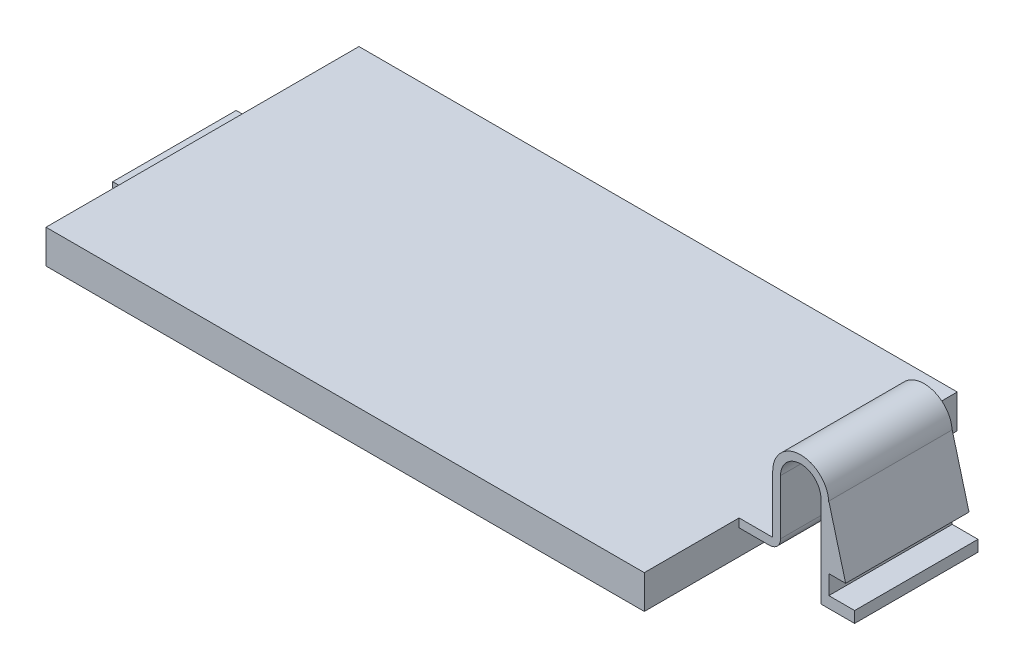
ISO-10303-21;
HEADER;
FILE_DESCRIPTION(('STEP AP214'),'2;1');
FILE_NAME('part.step','',(''),(''),'','','');
FILE_SCHEMA(('AUTOMOTIVE_DESIGN { 1 0 10303 214 1 1 1 1 }'));
ENDSEC;
DATA;
#1=APPLICATION_CONTEXT('core data for automotive mechanical design processes');
#2=APPLICATION_PROTOCOL_DEFINITION('international standard','automotive_design',2000,#1);
#3=PRODUCT_CONTEXT('',#1,'mechanical');
#4=PRODUCT('Part','Part','',(#3));
#5=PRODUCT_RELATED_PRODUCT_CATEGORY('part','',(#4));
#6=PRODUCT_DEFINITION_FORMATION('','',#4);
#7=PRODUCT_DEFINITION_CONTEXT('part definition',#1,'design');
#8=PRODUCT_DEFINITION('design','',#6,#7);
#9=PRODUCT_DEFINITION_SHAPE('','',#8);
#10=(LENGTH_UNIT() NAMED_UNIT(*) SI_UNIT(.MILLI.,.METRE.));
#11=(NAMED_UNIT(*) PLANE_ANGLE_UNIT() SI_UNIT($,.RADIAN.));
#12=(NAMED_UNIT(*) SI_UNIT($,.STERADIAN.) SOLID_ANGLE_UNIT());
#13=UNCERTAINTY_MEASURE_WITH_UNIT(LENGTH_MEASURE(1.E-05),#10,'distance_accuracy_value','');
#14=(GEOMETRIC_REPRESENTATION_CONTEXT(3) GLOBAL_UNCERTAINTY_ASSIGNED_CONTEXT((#13)) GLOBAL_UNIT_ASSIGNED_CONTEXT((#10,
#11,#12)) REPRESENTATION_CONTEXT('',''));
#15=CARTESIAN_POINT('',(0.,0.,0.));
#16=DIRECTION('',(0.,0.,1.));
#17=DIRECTION('',(1.,0.,0.));
#18=AXIS2_PLACEMENT_3D('',#15,#16,#17);
#19=CARTESIAN_POINT('',(57.9862488550397,2.66693819787849,5.39));
#20=DIRECTION('',(0.,0.,-1.));
#21=DIRECTION('',(-1.,0.,0.));
#22=AXIS2_PLACEMENT_3D('',#19,#20,#21);
#23=PLANE('',#22);
#24=DIRECTION('',(0.,1.,0.));
#25=VECTOR('',#24,1.);
#26=CARTESIAN_POINT('',(55.3402488550397,2.66693819787849,5.39));
#27=LINE('',#26,#25);
#28=CARTESIAN_POINT('',(55.3402488550397,1.6869381978785,5.39));
#29=VERTEX_POINT('',#28);
#30=CARTESIAN_POINT('',(55.3402488550397,2.4336981978785,5.39));
#31=VERTEX_POINT('',#30);
#32=EDGE_CURVE('E205',#29,#31,#27,.T.);
#33=ORIENTED_EDGE('',*,*,#32,.F.);
#34=DIRECTION('',(1.,0.,0.));
#35=VECTOR('',#34,1.);
#36=CARTESIAN_POINT('',(55.3402488550397,1.6869381978785,5.39));
#37=LINE('',#36,#35);
#38=CARTESIAN_POINT('',(57.9862488550397,1.68693819787849,5.39));
#39=VERTEX_POINT('',#38);
#40=EDGE_CURVE('E319',#29,#39,#37,.T.);
#41=ORIENTED_EDGE('',*,*,#40,.T.);
#42=CARTESIAN_POINT('',(57.9862488550397,2.66693819787849,5.39));
#43=DIRECTION('',(0.,0.,1.));
#44=DIRECTION('',(-1.,0.,0.));
#45=AXIS2_PLACEMENT_3D('',#42,#43,#44);
#46=CIRCLE('',#45,0.98);
#47=CARTESIAN_POINT('',(58.9662488550397,2.66693819787849,5.39));
#48=VERTEX_POINT('',#47);
#49=EDGE_CURVE('E321',#39,#48,#46,.T.);
#50=ORIENTED_EDGE('',*,*,#49,.T.);
#51=DIRECTION('',(0.,1.,0.));
#52=VECTOR('',#51,1.);
#53=CARTESIAN_POINT('',(58.9662488550397,2.66693819787849,5.39));
#54=LINE('',#53,#52);
#55=CARTESIAN_POINT('',(58.9662488550397,7.45036382161128,5.39));
#56=VERTEX_POINT('',#55);
#57=EDGE_CURVE('E323',#48,#56,#54,.T.);
#58=ORIENTED_EDGE('',*,*,#57,.T.);
#59=CARTESIAN_POINT('',(60.7302488550397,7.45036382161128,5.39));
#60=DIRECTION('',(0.,0.,-1.));
#61=DIRECTION('',(-1.,0.,0.));
#62=AXIS2_PLACEMENT_3D('',#59,#60,#61);
#63=CIRCLE('',#62,1.764);
#64=CARTESIAN_POINT('',(62.4942488550397,7.45036382161128,5.39));
#65=VERTEX_POINT('',#64);
#66=EDGE_CURVE('E325',#56,#65,#63,.T.);
#67=ORIENTED_EDGE('',*,*,#66,.T.);
#68=DIRECTION('',(0.,-1.,0.));
#69=VECTOR('',#68,1.);
#70=CARTESIAN_POINT('',(62.4942488550397,-0.506301802121507,5.39));
#71=LINE('',#70,#69);
#72=CARTESIAN_POINT('',(62.4942488550397,-0.506301802121507,5.39));
#73=VERTEX_POINT('',#72);
#74=EDGE_CURVE('E327',#65,#73,#71,.T.);
#75=ORIENTED_EDGE('',*,*,#74,.T.);
#76=DIRECTION('',(1.,0.,0.));
#77=VECTOR('',#76,1.);
#78=CARTESIAN_POINT('',(65.4342488550397,-0.506301802121507,5.39));
#79=LINE('',#78,#77);
#80=CARTESIAN_POINT('',(65.4342488550397,-0.506301802121507,5.39));
#81=VERTEX_POINT('',#80);
#82=EDGE_CURVE('E329',#73,#81,#79,.T.);
#83=ORIENTED_EDGE('',*,*,#82,.T.);
#84=DIRECTION('',(0.,1.,0.));
#85=VECTOR('',#84,1.);
#86=CARTESIAN_POINT('',(65.4342488550397,0.473698197878493,5.39));
#87=LINE('',#86,#85);
#88=CARTESIAN_POINT('',(65.4342488550397,0.473698197878493,5.39));
#89=VERTEX_POINT('',#88);
#90=EDGE_CURVE('E331',#81,#89,#87,.T.);
#91=ORIENTED_EDGE('',*,*,#90,.T.);
#92=DIRECTION('',(-1.,0.,0.));
#93=VECTOR('',#92,1.);
#94=CARTESIAN_POINT('',(63.1802488550397,0.473698197878493,5.39));
#95=LINE('',#94,#93);
#96=CARTESIAN_POINT('',(63.1802488550397,0.473698197878493,5.39));
#97=VERTEX_POINT('',#96);
#98=EDGE_CURVE('E333',#89,#97,#95,.T.);
#99=ORIENTED_EDGE('',*,*,#98,.T.);
#100=DIRECTION('',(0.,1.,0.));
#101=VECTOR('',#100,1.);
#102=CARTESIAN_POINT('',(63.1802488550397,2.13969819787849,5.39));
#103=LINE('',#102,#101);
#104=CARTESIAN_POINT('',(63.1802488550397,2.13969819787849,5.39));
#105=VERTEX_POINT('',#104);
#106=EDGE_CURVE('E335',#97,#105,#103,.T.);
#107=ORIENTED_EDGE('',*,*,#106,.T.);
#108=DIRECTION('',(1.,0.,0.));
#109=VECTOR('',#108,1.);
#110=CARTESIAN_POINT('',(64.6502488550397,2.13969819787849,5.39));
#111=LINE('',#110,#109);
#112=CARTESIAN_POINT('',(64.6502488550397,2.13969819787849,5.39));
#113=VERTEX_POINT('',#112);
#114=EDGE_CURVE('E337',#105,#113,#111,.T.);
#115=ORIENTED_EDGE('',*,*,#114,.T.);
#116=DIRECTION('',(-0.258819045102508,0.965925826289072,0.));
#117=VECTOR('',#116,1.);
#118=CARTESIAN_POINT('',(63.1802488550397,7.62581288500499,5.39));
#119=LINE('',#118,#117);
#120=CARTESIAN_POINT('',(63.1802488550397,7.62581288500499,5.39));
#121=VERTEX_POINT('',#120);
#122=EDGE_CURVE('E339',#113,#121,#119,.T.);
#123=ORIENTED_EDGE('',*,*,#122,.T.);
#124=DIRECTION('',(0.,-1.,0.));
#125=VECTOR('',#124,1.);
#126=CARTESIAN_POINT('',(63.1802488550397,7.62581288500499,5.39));
#127=LINE('',#126,#125);
#128=CARTESIAN_POINT('',(63.1802488550397,7.45036382161127,5.39));
#129=VERTEX_POINT('',#128);
#130=EDGE_CURVE('E341',#121,#129,#127,.T.);
#131=ORIENTED_EDGE('',*,*,#130,.T.);
#132=CARTESIAN_POINT('',(60.7302488550397,7.45036382161127,5.39));
#133=DIRECTION('',(0.,0.,1.));
#134=DIRECTION('',(-1.,0.,0.));
#135=AXIS2_PLACEMENT_3D('',#132,#133,#134);
#136=CIRCLE('',#135,2.45);
#137=CARTESIAN_POINT('',(58.2802488550397,7.45036382161127,5.39));
#138=VERTEX_POINT('',#137);
#139=EDGE_CURVE('E174',#129,#138,#136,.T.);
#140=ORIENTED_EDGE('',*,*,#139,.T.);
#141=DIRECTION('',(0.,-1.,0.));
#142=VECTOR('',#141,1.);
#143=CARTESIAN_POINT('',(58.2802488550397,2.4336981978785,5.39));
#144=LINE('',#143,#142);
#145=CARTESIAN_POINT('',(58.2802488550397,2.4336981978785,5.39));
#146=VERTEX_POINT('',#145);
#147=EDGE_CURVE('E171',#138,#146,#144,.T.);
#148=ORIENTED_EDGE('',*,*,#147,.T.);
#149=DIRECTION('',(-1.,0.,0.));
#150=VECTOR('',#149,1.);
#151=CARTESIAN_POINT('',(55.3402488550397,2.4336981978785,5.39));
#152=LINE('',#151,#150);
#153=EDGE_CURVE('E50',#146,#31,#152,.T.);
#154=ORIENTED_EDGE('',*,*,#153,.T.);
#155=EDGE_LOOP('',(#33,#41,#50,#58,#67,#75,#83,#91,#99,#107,#115,#123,#131,#140,#148,#154));
#156=FACE_BOUND('',#155,.T.);
#157=ADVANCED_FACE('F35',(#156),#23,.F.);
#158=DIRECTION('',(0.,-1.,0.));
#159=VECTOR('',#158,1.);
#160=CARTESIAN_POINT('',(3.06704885503969,2.66693819787849,5.39));
#161=LINE('',#160,#159);
#162=CARTESIAN_POINT('',(3.06704885503968,0.512898197878493,5.39));
#163=VERTEX_POINT('',#162);
#164=CARTESIAN_POINT('',(3.06704885503968,0.0228981978784935,5.39));
#165=VERTEX_POINT('',#164);
#166=EDGE_CURVE('E310',#163,#165,#161,.T.);
#167=ORIENTED_EDGE('',*,*,#166,.F.);
#168=DIRECTION('',(-1.,0.,0.));
#169=VECTOR('',#168,1.);
#170=CARTESIAN_POINT('',(3.06704885503968,0.512898197878493,5.39));
#171=LINE('',#170,#169);
#172=CARTESIAN_POINT('',(0.617048855039684,0.512898197878493,5.39));
#173=VERTEX_POINT('',#172);
#174=EDGE_CURVE('E59',#163,#173,#171,.T.);
#175=ORIENTED_EDGE('',*,*,#174,.T.);
#176=DIRECTION('',(0.,-1.,0.));
#177=VECTOR('',#176,1.);
#178=CARTESIAN_POINT('',(0.617048855039684,0.512898197878493,5.39));
#179=LINE('',#178,#177);
#180=CARTESIAN_POINT('',(0.617048855039684,0.0228981978784935,5.39));
#181=VERTEX_POINT('',#180);
#182=EDGE_CURVE('E238',#173,#181,#179,.T.);
#183=ORIENTED_EDGE('',*,*,#182,.T.);
#184=DIRECTION('',(1.,0.,0.));
#185=VECTOR('',#184,1.);
#186=CARTESIAN_POINT('',(0.617048855039684,0.0228981978784935,5.39));
#187=LINE('',#186,#185);
#188=EDGE_CURVE('E125',#181,#165,#187,.T.);
#189=ORIENTED_EDGE('',*,*,#188,.T.);
#190=EDGE_LOOP('',(#167,#175,#183,#189));
#191=FACE_BOUND('',#190,.T.);
#192=ADVANCED_FACE('F425',(#191),#23,.F.);
#193=CARTESIAN_POINT('',(57.9862488550397,2.66693819787849,-5.39));
#194=DIRECTION('',(0.,0.,-1.));
#195=DIRECTION('',(-1.,0.,0.));
#196=AXIS2_PLACEMENT_3D('',#193,#194,#195);
#197=PLANE('',#196);
#198=DIRECTION('',(1.,0.,0.));
#199=VECTOR('',#198,1.);
#200=CARTESIAN_POINT('',(57.9862488550397,1.68693819787849,-5.39));
#201=LINE('',#200,#199);
#202=CARTESIAN_POINT('',(55.3402488550397,1.6869381978785,-5.39));
#203=VERTEX_POINT('',#202);
#204=CARTESIAN_POINT('',(57.9862488550397,1.68693819787849,-5.39));
#205=VERTEX_POINT('',#204);
#206=EDGE_CURVE('E208',#203,#205,#201,.T.);
#207=ORIENTED_EDGE('',*,*,#206,.F.);
#208=DIRECTION('',(0.,1.,0.));
#209=VECTOR('',#208,1.);
#210=CARTESIAN_POINT('',(55.3402488550397,2.66693819787849,-5.39));
#211=LINE('',#210,#209);
#212=CARTESIAN_POINT('',(55.3402488550397,2.43369819787849,-5.39));
#213=VERTEX_POINT('',#212);
#214=EDGE_CURVE('E11',#203,#213,#211,.T.);
#215=ORIENTED_EDGE('',*,*,#214,.T.);
#216=DIRECTION('',(-1.,0.,0.));
#217=VECTOR('',#216,1.);
#218=CARTESIAN_POINT('',(55.3402488550397,2.4336981978785,-5.39));
#219=LINE('',#218,#217);
#220=CARTESIAN_POINT('',(58.2802488550397,2.4336981978785,-5.39));
#221=VERTEX_POINT('',#220);
#222=EDGE_CURVE('E235',#221,#213,#219,.T.);
#223=ORIENTED_EDGE('',*,*,#222,.F.);
#224=DIRECTION('',(0.,-1.,0.));
#225=VECTOR('',#224,1.);
#226=CARTESIAN_POINT('',(58.2802488550397,2.4336981978785,-5.39));
#227=LINE('',#226,#225);
#228=CARTESIAN_POINT('',(58.2802488550397,7.45036382161127,-5.39));
#229=VERTEX_POINT('',#228);
#230=EDGE_CURVE('E184',#229,#221,#227,.T.);
#231=ORIENTED_EDGE('',*,*,#230,.F.);
#232=CARTESIAN_POINT('',(60.7302488550397,7.45036382161127,-5.39));
#233=DIRECTION('',(0.,0.,1.));
#234=DIRECTION('',(-1.,0.,0.));
#235=AXIS2_PLACEMENT_3D('',#232,#233,#234);
#236=CIRCLE('',#235,2.45);
#237=CARTESIAN_POINT('',(63.1802488550397,7.45036382161127,-5.39));
#238=VERTEX_POINT('',#237);
#239=EDGE_CURVE('E232',#238,#229,#236,.T.);
#240=ORIENTED_EDGE('',*,*,#239,.F.);
#241=DIRECTION('',(0.,-1.,0.));
#242=VECTOR('',#241,1.);
#243=CARTESIAN_POINT('',(63.1802488550397,7.62581288500499,-5.39));
#244=LINE('',#243,#242);
#245=CARTESIAN_POINT('',(63.1802488550397,7.62581288500499,-5.39));
#246=VERTEX_POINT('',#245);
#247=EDGE_CURVE('E230',#246,#238,#244,.T.);
#248=ORIENTED_EDGE('',*,*,#247,.F.);
#249=DIRECTION('',(-0.258819045102508,0.965925826289072,0.));
#250=VECTOR('',#249,1.);
#251=CARTESIAN_POINT('',(63.1802488550397,7.62581288500499,-5.39));
#252=LINE('',#251,#250);
#253=CARTESIAN_POINT('',(64.6502488550397,2.13969819787849,-5.39));
#254=VERTEX_POINT('',#253);
#255=EDGE_CURVE('E228',#254,#246,#252,.T.);
#256=ORIENTED_EDGE('',*,*,#255,.F.);
#257=DIRECTION('',(1.,0.,0.));
#258=VECTOR('',#257,1.);
#259=CARTESIAN_POINT('',(64.6502488550397,2.13969819787849,-5.39));
#260=LINE('',#259,#258);
#261=CARTESIAN_POINT('',(63.1802488550397,2.13969819787849,-5.39));
#262=VERTEX_POINT('',#261);
#263=EDGE_CURVE('E226',#262,#254,#260,.T.);
#264=ORIENTED_EDGE('',*,*,#263,.F.);
#265=DIRECTION('',(0.,1.,0.));
#266=VECTOR('',#265,1.);
#267=CARTESIAN_POINT('',(63.1802488550397,2.13969819787849,-5.39));
#268=LINE('',#267,#266);
#269=CARTESIAN_POINT('',(63.1802488550397,0.473698197878493,-5.39));
#270=VERTEX_POINT('',#269);
#271=EDGE_CURVE('E224',#270,#262,#268,.T.);
#272=ORIENTED_EDGE('',*,*,#271,.F.);
#273=DIRECTION('',(-1.,0.,0.));
#274=VECTOR('',#273,1.);
#275=CARTESIAN_POINT('',(63.1802488550397,0.473698197878493,-5.39));
#276=LINE('',#275,#274);
#277=CARTESIAN_POINT('',(65.4342488550397,0.473698197878493,-5.39));
#278=VERTEX_POINT('',#277);
#279=EDGE_CURVE('E222',#278,#270,#276,.T.);
#280=ORIENTED_EDGE('',*,*,#279,.F.);
#281=DIRECTION('',(0.,1.,0.));
#282=VECTOR('',#281,1.);
#283=CARTESIAN_POINT('',(65.4342488550397,0.473698197878493,-5.39));
#284=LINE('',#283,#282);
#285=CARTESIAN_POINT('',(65.4342488550397,-0.506301802121507,-5.39));
#286=VERTEX_POINT('',#285);
#287=EDGE_CURVE('E220',#286,#278,#284,.T.);
#288=ORIENTED_EDGE('',*,*,#287,.F.);
#289=DIRECTION('',(1.,0.,0.));
#290=VECTOR('',#289,1.);
#291=CARTESIAN_POINT('',(65.4342488550397,-0.506301802121507,-5.39));
#292=LINE('',#291,#290);
#293=CARTESIAN_POINT('',(62.4942488550397,-0.506301802121507,-5.39));
#294=VERTEX_POINT('',#293);
#295=EDGE_CURVE('E218',#294,#286,#292,.T.);
#296=ORIENTED_EDGE('',*,*,#295,.F.);
#297=DIRECTION('',(0.,-1.,0.));
#298=VECTOR('',#297,1.);
#299=CARTESIAN_POINT('',(62.4942488550397,-0.506301802121507,-5.39));
#300=LINE('',#299,#298);
#301=CARTESIAN_POINT('',(62.4942488550397,7.45036382161128,-5.39));
#302=VERTEX_POINT('',#301);
#303=EDGE_CURVE('E216',#302,#294,#300,.T.);
#304=ORIENTED_EDGE('',*,*,#303,.F.);
#305=CARTESIAN_POINT('',(60.7302488550397,7.45036382161128,-5.39));
#306=DIRECTION('',(0.,0.,-1.));
#307=DIRECTION('',(-1.,0.,0.));
#308=AXIS2_PLACEMENT_3D('',#305,#306,#307);
#309=CIRCLE('',#308,1.764);
#310=CARTESIAN_POINT('',(58.9662488550397,7.45036382161128,-5.39));
#311=VERTEX_POINT('',#310);
#312=EDGE_CURVE('E214',#311,#302,#309,.T.);
#313=ORIENTED_EDGE('',*,*,#312,.F.);
#314=DIRECTION('',(0.,1.,0.));
#315=VECTOR('',#314,1.);
#316=CARTESIAN_POINT('',(58.9662488550397,2.66693819787849,-5.39));
#317=LINE('',#316,#315);
#318=CARTESIAN_POINT('',(58.9662488550397,2.66693819787849,-5.39));
#319=VERTEX_POINT('',#318);
#320=EDGE_CURVE('E212',#319,#311,#317,.T.);
#321=ORIENTED_EDGE('',*,*,#320,.F.);
#322=CARTESIAN_POINT('',(57.9862488550397,2.66693819787849,-5.39));
#323=DIRECTION('',(0.,0.,1.));
#324=DIRECTION('',(-1.,0.,0.));
#325=AXIS2_PLACEMENT_3D('',#322,#323,#324);
#326=CIRCLE('',#325,0.98);
#327=EDGE_CURVE('E210',#205,#319,#326,.T.);
#328=ORIENTED_EDGE('',*,*,#327,.F.);
#329=EDGE_LOOP('',(#207,#215,#223,#231,#240,#248,#256,#264,#272,#280,#288,#296,#304,#313,#321,#328));
#330=FACE_BOUND('',#329,.T.);
#331=ADVANCED_FACE('F354',(#330),#197,.T.);
#332=DIRECTION('',(-1.,0.,0.));
#333=VECTOR('',#332,1.);
#334=CARTESIAN_POINT('',(3.06704885503968,0.512898197878493,-5.39));
#335=LINE('',#334,#333);
#336=CARTESIAN_POINT('',(3.06704885503969,0.512898197878493,-5.39));
#337=VERTEX_POINT('',#336);
#338=CARTESIAN_POINT('',(0.617048855039684,0.512898197878493,-5.39));
#339=VERTEX_POINT('',#338);
#340=EDGE_CURVE('E116',#337,#339,#335,.T.);
#341=ORIENTED_EDGE('',*,*,#340,.F.);
#342=DIRECTION('',(0.,-1.,0.));
#343=VECTOR('',#342,1.);
#344=CARTESIAN_POINT('',(3.06704885503969,2.66693819787849,-5.39));
#345=LINE('',#344,#343);
#346=CARTESIAN_POINT('',(3.06704885503969,0.0228981978784935,-5.39));
#347=VERTEX_POINT('',#346);
#348=EDGE_CURVE('E43',#337,#347,#345,.T.);
#349=ORIENTED_EDGE('',*,*,#348,.T.);
#350=DIRECTION('',(1.,0.,0.));
#351=VECTOR('',#350,1.);
#352=CARTESIAN_POINT('',(0.617048855039684,0.0228981978784935,-5.39));
#353=LINE('',#352,#351);
#354=CARTESIAN_POINT('',(0.617048855039684,0.0228981978784935,-5.39));
#355=VERTEX_POINT('',#354);
#356=EDGE_CURVE('E204',#355,#347,#353,.T.);
#357=ORIENTED_EDGE('',*,*,#356,.F.);
#358=DIRECTION('',(0.,-1.,0.));
#359=VECTOR('',#358,1.);
#360=CARTESIAN_POINT('',(0.617048855039684,0.512898197878493,-5.39));
#361=LINE('',#360,#359);
#362=EDGE_CURVE('E201',#339,#355,#361,.T.);
#363=ORIENTED_EDGE('',*,*,#362,.F.);
#364=EDGE_LOOP('',(#341,#349,#357,#363));
#365=FACE_BOUND('',#364,.T.);
#366=ADVANCED_FACE('F298',(#365),#197,.T.);
#367=CARTESIAN_POINT('',(0.617048855039684,0.512898197878493,5.39));
#368=DIRECTION('',(1.,0.,0.));
#369=DIRECTION('',(0.,1.,0.));
#370=AXIS2_PLACEMENT_3D('',#367,#368,#369);
#371=PLANE('',#370);
#372=ORIENTED_EDGE('',*,*,#362,.T.);
#373=DIRECTION('',(0.,0.,-1.));
#374=VECTOR('',#373,1.);
#375=CARTESIAN_POINT('',(0.617048855039684,0.0228981978784935,5.39));
#376=LINE('',#375,#374);
#377=EDGE_CURVE('E293',#181,#355,#376,.T.);
#378=ORIENTED_EDGE('',*,*,#377,.F.);
#379=ORIENTED_EDGE('',*,*,#182,.F.);
#380=DIRECTION('',(0.,0.,-1.));
#381=VECTOR('',#380,1.);
#382=CARTESIAN_POINT('',(0.617048855039684,0.512898197878493,5.39));
#383=LINE('',#382,#381);
#384=EDGE_CURVE('E197',#173,#339,#383,.T.);
#385=ORIENTED_EDGE('',*,*,#384,.T.);
#386=EDGE_LOOP('',(#372,#378,#379,#385));
#387=FACE_BOUND('',#386,.T.);
#388=ADVANCED_FACE('F37',(#387),#371,.F.);
#389=CARTESIAN_POINT('',(0.617048855039684,0.0228981978784935,5.39));
#390=DIRECTION('',(0.,1.,0.));
#391=DIRECTION('',(0.,0.,1.));
#392=AXIS2_PLACEMENT_3D('',#389,#390,#391);
#393=PLANE('',#392);
#394=ORIENTED_EDGE('',*,*,#356,.T.);
#395=DIRECTION('',(0.,0.,-1.));
#396=VECTOR('',#395,1.);
#397=CARTESIAN_POINT('',(3.06704885503968,0.0228981978784935,5.39));
#398=LINE('',#397,#396);
#399=EDGE_CURVE('E290',#165,#347,#398,.T.);
#400=ORIENTED_EDGE('',*,*,#399,.F.);
#401=ORIENTED_EDGE('',*,*,#188,.F.);
#402=ORIENTED_EDGE('',*,*,#377,.T.);
#403=EDGE_LOOP('',(#394,#400,#401,#402));
#404=FACE_BOUND('',#403,.T.);
#405=ADVANCED_FACE('F305',(#404),#393,.F.);
#406=CARTESIAN_POINT('',(3.06704885503968,-0.506301802121506,5.39));
#407=DIRECTION('',(0.,1.,0.));
#408=DIRECTION('',(0.,0.,1.));
#409=AXIS2_PLACEMENT_3D('',#406,#407,#408);
#410=PLANE('',#409);
#411=DIRECTION('',(0.,0.,-1.));
#412=VECTOR('',#411,1.);
#413=CARTESIAN_POINT('',(3.06704885503968,-0.506301802121506,5.39));
#414=LINE('',#413,#412);
#415=CARTESIAN_POINT('',(3.06704885503968,-0.506301802121506,13.671));
#416=VERTEX_POINT('',#415);
#417=CARTESIAN_POINT('',(3.06704885503968,-0.506301802121506,-13.671));
#418=VERTEX_POINT('',#417);
#419=EDGE_CURVE('E287',#416,#418,#414,.T.);
#420=ORIENTED_EDGE('',*,*,#419,.T.);
#421=DIRECTION('',(1.,0.,0.));
#422=VECTOR('',#421,1.);
#423=CARTESIAN_POINT('',(3.06704885503968,-0.506301802121506,-13.671));
#424=LINE('',#423,#422);
#425=CARTESIAN_POINT('',(55.3402488550397,-0.506301802121506,-13.671));
#426=VERTEX_POINT('',#425);
#427=EDGE_CURVE('E389',#418,#426,#424,.T.);
#428=ORIENTED_EDGE('',*,*,#427,.T.);
#429=DIRECTION('',(0.,0.,-1.));
#430=VECTOR('',#429,1.);
#431=CARTESIAN_POINT('',(55.3402488550397,-0.506301802121506,5.39));
#432=LINE('',#431,#430);
#433=CARTESIAN_POINT('',(55.3402488550397,-0.506301802121506,13.671));
#434=VERTEX_POINT('',#433);
#435=EDGE_CURVE('E284',#434,#426,#432,.T.);
#436=ORIENTED_EDGE('',*,*,#435,.F.);
#437=DIRECTION('',(1.,0.,0.));
#438=VECTOR('',#437,1.);
#439=CARTESIAN_POINT('',(3.06704885503968,-0.506301802121506,13.671));
#440=LINE('',#439,#438);
#441=EDGE_CURVE('E387',#416,#434,#440,.T.);
#442=ORIENTED_EDGE('',*,*,#441,.F.);
#443=EDGE_LOOP('',(#420,#428,#436,#442));
#444=FACE_BOUND('',#443,.T.);
#445=ADVANCED_FACE('F385',(#444),#410,.F.);
#446=CARTESIAN_POINT('',(55.3402488550397,-0.506301802121506,5.39));
#447=DIRECTION('',(-1.,0.,0.));
#448=DIRECTION('',(0.,0.,1.));
#449=AXIS2_PLACEMENT_3D('',#446,#447,#448);
#450=PLANE('',#449);
#451=ORIENTED_EDGE('',*,*,#435,.T.);
#452=DIRECTION('',(0.,1.,0.));
#453=VECTOR('',#452,1.);
#454=CARTESIAN_POINT('',(55.3402488550397,2.43369819787849,-13.671));
#455=LINE('',#454,#453);
#456=CARTESIAN_POINT('',(55.3402488550397,2.43369819787849,-13.671));
#457=VERTEX_POINT('',#456);
#458=EDGE_CURVE('E409',#426,#457,#455,.T.);
#459=ORIENTED_EDGE('',*,*,#458,.T.);
#460=DIRECTION('',(0.,0.,-1.));
#461=VECTOR('',#460,1.);
#462=CARTESIAN_POINT('',(55.3402488550397,2.43369819787849,13.671));
#463=LINE('',#462,#461);
#464=EDGE_CURVE('E313',#213,#457,#463,.T.);
#465=ORIENTED_EDGE('',*,*,#464,.F.);
#466=ORIENTED_EDGE('',*,*,#214,.F.);
#467=DIRECTION('',(0.,0.,-1.));
#468=VECTOR('',#467,1.);
#469=CARTESIAN_POINT('',(55.3402488550397,1.6869381978785,5.39));
#470=LINE('',#469,#468);
#471=EDGE_CURVE('E281',#29,#203,#470,.T.);
#472=ORIENTED_EDGE('',*,*,#471,.F.);
#473=ORIENTED_EDGE('',*,*,#32,.T.);
#474=CARTESIAN_POINT('',(55.3402488550397,2.43369819787849,13.671));
#475=VERTEX_POINT('',#474);
#476=EDGE_CURVE('E195',#475,#31,#463,.T.);
#477=ORIENTED_EDGE('',*,*,#476,.F.);
#478=DIRECTION('',(0.,1.,0.));
#479=VECTOR('',#478,1.);
#480=CARTESIAN_POINT('',(55.3402488550397,2.43369819787849,13.671));
#481=LINE('',#480,#479);
#482=EDGE_CURVE('E391',#434,#475,#481,.T.);
#483=ORIENTED_EDGE('',*,*,#482,.F.);
#484=EDGE_LOOP('',(#451,#459,#465,#466,#472,#473,#477,#483));
#485=FACE_BOUND('',#484,.T.);
#486=ADVANCED_FACE('F392',(#485),#450,.F.);
#487=CARTESIAN_POINT('',(57.9862488550397,1.68693819787849,5.39));
#488=DIRECTION('',(0.,1.,0.));
#489=DIRECTION('',(-1.,0.,0.));
#490=AXIS2_PLACEMENT_3D('',#487,#488,#489);
#491=PLANE('',#490);
#492=ORIENTED_EDGE('',*,*,#206,.T.);
#493=DIRECTION('',(0.,0.,-1.));
#494=VECTOR('',#493,1.);
#495=CARTESIAN_POINT('',(57.9862488550397,1.68693819787849,5.39));
#496=LINE('',#495,#494);
#497=EDGE_CURVE('E278',#39,#205,#496,.T.);
#498=ORIENTED_EDGE('',*,*,#497,.F.);
#499=ORIENTED_EDGE('',*,*,#40,.F.);
#500=ORIENTED_EDGE('',*,*,#471,.T.);
#501=EDGE_LOOP('',(#492,#498,#499,#500));
#502=FACE_BOUND('',#501,.T.);
#503=ADVANCED_FACE('F452',(#502),#491,.F.);
#504=CARTESIAN_POINT('',(57.9862488550397,2.66693819787849,5.39));
#505=DIRECTION('',(0.,0.,-1.));
#506=DIRECTION('',(-1.,0.,0.));
#507=AXIS2_PLACEMENT_3D('',#504,#505,#506);
#508=CYLINDRICAL_SURFACE('',#507,0.98);
#509=ORIENTED_EDGE('',*,*,#327,.T.);
#510=DIRECTION('',(0.,0.,-1.));
#511=VECTOR('',#510,1.);
#512=CARTESIAN_POINT('',(58.9662488550397,2.66693819787849,5.39));
#513=LINE('',#512,#511);
#514=EDGE_CURVE('E275',#48,#319,#513,.T.);
#515=ORIENTED_EDGE('',*,*,#514,.F.);
#516=ORIENTED_EDGE('',*,*,#49,.F.);
#517=ORIENTED_EDGE('',*,*,#497,.T.);
#518=EDGE_LOOP('',(#509,#515,#516,#517));
#519=FACE_BOUND('',#518,.T.);
#520=ADVANCED_FACE('F455',(#519),#508,.T.);
#521=CARTESIAN_POINT('',(58.9662488550397,2.66693819787849,5.39));
#522=DIRECTION('',(-1.,0.,0.));
#523=DIRECTION('',(0.,0.,1.));
#524=AXIS2_PLACEMENT_3D('',#521,#522,#523);
#525=PLANE('',#524);
#526=ORIENTED_EDGE('',*,*,#320,.T.);
#527=DIRECTION('',(0.,0.,-1.));
#528=VECTOR('',#527,1.);
#529=CARTESIAN_POINT('',(58.9662488550397,7.45036382161128,5.39));
#530=LINE('',#529,#528);
#531=EDGE_CURVE('E272',#56,#311,#530,.T.);
#532=ORIENTED_EDGE('',*,*,#531,.F.);
#533=ORIENTED_EDGE('',*,*,#57,.F.);
#534=ORIENTED_EDGE('',*,*,#514,.T.);
#535=EDGE_LOOP('',(#526,#532,#533,#534));
#536=FACE_BOUND('',#535,.T.);
#537=ADVANCED_FACE('F459',(#536),#525,.F.);
#538=CARTESIAN_POINT('',(60.7302488550397,7.45036382161128,5.39));
#539=DIRECTION('',(0.,0.,-1.));
#540=DIRECTION('',(-1.,0.,0.));
#541=AXIS2_PLACEMENT_3D('',#538,#539,#540);
#542=CYLINDRICAL_SURFACE('',#541,1.764);
#543=ORIENTED_EDGE('',*,*,#312,.T.);
#544=DIRECTION('',(0.,0.,-1.));
#545=VECTOR('',#544,1.);
#546=CARTESIAN_POINT('',(62.4942488550397,7.45036382161128,5.39));
#547=LINE('',#546,#545);
#548=EDGE_CURVE('E269',#65,#302,#547,.T.);
#549=ORIENTED_EDGE('',*,*,#548,.F.);
#550=ORIENTED_EDGE('',*,*,#66,.F.);
#551=ORIENTED_EDGE('',*,*,#531,.T.);
#552=EDGE_LOOP('',(#543,#549,#550,#551));
#553=FACE_BOUND('',#552,.T.);
#554=ADVANCED_FACE('F463',(#553),#542,.F.);
#555=CARTESIAN_POINT('',(62.4942488550397,-0.506301802121507,5.39));
#556=DIRECTION('',(1.,0.,0.));
#557=DIRECTION('',(0.,0.,-1.));
#558=AXIS2_PLACEMENT_3D('',#555,#556,#557);
#559=PLANE('',#558);
#560=ORIENTED_EDGE('',*,*,#303,.T.);
#561=DIRECTION('',(0.,0.,-1.));
#562=VECTOR('',#561,1.);
#563=CARTESIAN_POINT('',(62.4942488550397,-0.506301802121507,5.39));
#564=LINE('',#563,#562);
#565=EDGE_CURVE('E266',#73,#294,#564,.T.);
#566=ORIENTED_EDGE('',*,*,#565,.F.);
#567=ORIENTED_EDGE('',*,*,#74,.F.);
#568=ORIENTED_EDGE('',*,*,#548,.T.);
#569=EDGE_LOOP('',(#560,#566,#567,#568));
#570=FACE_BOUND('',#569,.T.);
#571=ADVANCED_FACE('F467',(#570),#559,.F.);
#572=CARTESIAN_POINT('',(65.4342488550397,-0.506301802121507,5.39));
#573=DIRECTION('',(0.,1.,0.));
#574=DIRECTION('',(-1.,0.,0.));
#575=AXIS2_PLACEMENT_3D('',#572,#573,#574);
#576=PLANE('',#575);
#577=ORIENTED_EDGE('',*,*,#295,.T.);
#578=DIRECTION('',(0.,0.,-1.));
#579=VECTOR('',#578,1.);
#580=CARTESIAN_POINT('',(65.4342488550397,-0.506301802121507,5.39));
#581=LINE('',#580,#579);
#582=EDGE_CURVE('E263',#81,#286,#581,.T.);
#583=ORIENTED_EDGE('',*,*,#582,.F.);
#584=ORIENTED_EDGE('',*,*,#82,.F.);
#585=ORIENTED_EDGE('',*,*,#565,.T.);
#586=EDGE_LOOP('',(#577,#583,#584,#585));
#587=FACE_BOUND('',#586,.T.);
#588=ADVANCED_FACE('F471',(#587),#576,.F.);
#589=CARTESIAN_POINT('',(65.4342488550397,0.473698197878493,5.39));
#590=DIRECTION('',(-1.,0.,0.));
#591=DIRECTION('',(0.,0.,1.));
#592=AXIS2_PLACEMENT_3D('',#589,#590,#591);
#593=PLANE('',#592);
#594=ORIENTED_EDGE('',*,*,#287,.T.);
#595=DIRECTION('',(0.,0.,-1.));
#596=VECTOR('',#595,1.);
#597=CARTESIAN_POINT('',(65.4342488550397,0.473698197878493,5.39));
#598=LINE('',#597,#596);
#599=EDGE_CURVE('E260',#89,#278,#598,.T.);
#600=ORIENTED_EDGE('',*,*,#599,.F.);
#601=ORIENTED_EDGE('',*,*,#90,.F.);
#602=ORIENTED_EDGE('',*,*,#582,.T.);
#603=EDGE_LOOP('',(#594,#600,#601,#602));
#604=FACE_BOUND('',#603,.T.);
#605=ADVANCED_FACE('F475',(#604),#593,.F.);
#606=CARTESIAN_POINT('',(63.1802488550397,0.473698197878493,5.39));
#607=DIRECTION('',(0.,-1.,0.));
#608=DIRECTION('',(1.,0.,0.));
#609=AXIS2_PLACEMENT_3D('',#606,#607,#608);
#610=PLANE('',#609);
#611=ORIENTED_EDGE('',*,*,#279,.T.);
#612=DIRECTION('',(0.,0.,-1.));
#613=VECTOR('',#612,1.);
#614=CARTESIAN_POINT('',(63.1802488550397,0.473698197878493,5.39));
#615=LINE('',#614,#613);
#616=EDGE_CURVE('E257',#97,#270,#615,.T.);
#617=ORIENTED_EDGE('',*,*,#616,.F.);
#618=ORIENTED_EDGE('',*,*,#98,.F.);
#619=ORIENTED_EDGE('',*,*,#599,.T.);
#620=EDGE_LOOP('',(#611,#617,#618,#619));
#621=FACE_BOUND('',#620,.T.);
#622=ADVANCED_FACE('F479',(#621),#610,.F.);
#623=CARTESIAN_POINT('',(63.1802488550397,2.13969819787849,5.39));
#624=DIRECTION('',(-1.,0.,0.));
#625=DIRECTION('',(0.,-1.,0.));
#626=AXIS2_PLACEMENT_3D('',#623,#624,#625);
#627=PLANE('',#626);
#628=ORIENTED_EDGE('',*,*,#271,.T.);
#629=DIRECTION('',(0.,0.,-1.));
#630=VECTOR('',#629,1.);
#631=CARTESIAN_POINT('',(63.1802488550397,2.13969819787849,5.39));
#632=LINE('',#631,#630);
#633=EDGE_CURVE('E254',#105,#262,#632,.T.);
#634=ORIENTED_EDGE('',*,*,#633,.F.);
#635=ORIENTED_EDGE('',*,*,#106,.F.);
#636=ORIENTED_EDGE('',*,*,#616,.T.);
#637=EDGE_LOOP('',(#628,#634,#635,#636));
#638=FACE_BOUND('',#637,.T.);
#639=ADVANCED_FACE('F483',(#638),#627,.F.);
#640=CARTESIAN_POINT('',(64.6502488550397,2.13969819787849,5.39));
#641=DIRECTION('',(0.,1.,0.));
#642=DIRECTION('',(0.,0.,1.));
#643=AXIS2_PLACEMENT_3D('',#640,#641,#642);
#644=PLANE('',#643);
#645=ORIENTED_EDGE('',*,*,#263,.T.);
#646=DIRECTION('',(0.,0.,-1.));
#647=VECTOR('',#646,1.);
#648=CARTESIAN_POINT('',(64.6502488550397,2.13969819787849,5.39));
#649=LINE('',#648,#647);
#650=EDGE_CURVE('E251',#113,#254,#649,.T.);
#651=ORIENTED_EDGE('',*,*,#650,.F.);
#652=ORIENTED_EDGE('',*,*,#114,.F.);
#653=ORIENTED_EDGE('',*,*,#633,.T.);
#654=EDGE_LOOP('',(#645,#651,#652,#653));
#655=FACE_BOUND('',#654,.T.);
#656=ADVANCED_FACE('F487',(#655),#644,.F.);
#657=CARTESIAN_POINT('',(63.1802488550397,7.62581288500499,5.39));
#658=DIRECTION('',(-0.965925826289072,-0.258819045102508,0.));
#659=DIRECTION('',(0.258819045102508,-0.965925826289072,0.));
#660=AXIS2_PLACEMENT_3D('',#657,#658,#659);
#661=PLANE('',#660);
#662=ORIENTED_EDGE('',*,*,#255,.T.);
#663=DIRECTION('',(0.,0.,-1.));
#664=VECTOR('',#663,1.);
#665=CARTESIAN_POINT('',(63.1802488550397,7.62581288500499,5.39));
#666=LINE('',#665,#664);
#667=EDGE_CURVE('E248',#121,#246,#666,.T.);
#668=ORIENTED_EDGE('',*,*,#667,.F.);
#669=ORIENTED_EDGE('',*,*,#122,.F.);
#670=ORIENTED_EDGE('',*,*,#650,.T.);
#671=EDGE_LOOP('',(#662,#668,#669,#670));
#672=FACE_BOUND('',#671,.T.);
#673=ADVANCED_FACE('F491',(#672),#661,.F.);
#674=CARTESIAN_POINT('',(63.1802488550397,7.62581288500499,5.39));
#675=DIRECTION('',(1.,0.,0.));
#676=DIRECTION('',(0.,0.,-1.));
#677=AXIS2_PLACEMENT_3D('',#674,#675,#676);
#678=PLANE('',#677);
#679=ORIENTED_EDGE('',*,*,#247,.T.);
#680=DIRECTION('',(0.,0.,-1.));
#681=VECTOR('',#680,1.);
#682=CARTESIAN_POINT('',(63.1802488550397,7.45036382161127,5.39));
#683=LINE('',#682,#681);
#684=EDGE_CURVE('E245',#129,#238,#683,.T.);
#685=ORIENTED_EDGE('',*,*,#684,.F.);
#686=ORIENTED_EDGE('',*,*,#130,.F.);
#687=ORIENTED_EDGE('',*,*,#667,.T.);
#688=EDGE_LOOP('',(#679,#685,#686,#687));
#689=FACE_BOUND('',#688,.T.);
#690=ADVANCED_FACE('F347',(#689),#678,.F.);
#691=CARTESIAN_POINT('',(60.7302488550397,7.45036382161127,5.39));
#692=DIRECTION('',(0.,0.,-1.));
#693=DIRECTION('',(-1.,0.,0.));
#694=AXIS2_PLACEMENT_3D('',#691,#692,#693);
#695=CYLINDRICAL_SURFACE('',#694,2.45);
#696=ORIENTED_EDGE('',*,*,#239,.T.);
#697=DIRECTION('',(0.,0.,-1.));
#698=VECTOR('',#697,1.);
#699=CARTESIAN_POINT('',(58.2802488550397,7.45036382161127,5.39));
#700=LINE('',#699,#698);
#701=EDGE_CURVE('E187',#138,#229,#700,.T.);
#702=ORIENTED_EDGE('',*,*,#701,.F.);
#703=ORIENTED_EDGE('',*,*,#139,.F.);
#704=ORIENTED_EDGE('',*,*,#684,.T.);
#705=EDGE_LOOP('',(#696,#702,#703,#704));
#706=FACE_BOUND('',#705,.T.);
#707=ADVANCED_FACE('F351',(#706),#695,.T.);
#708=CARTESIAN_POINT('',(58.2802488550397,2.4336981978785,5.39));
#709=DIRECTION('',(1.,0.,0.));
#710=DIRECTION('',(0.,0.,-1.));
#711=AXIS2_PLACEMENT_3D('',#708,#709,#710);
#712=PLANE('',#711);
#713=ORIENTED_EDGE('',*,*,#230,.T.);
#714=DIRECTION('',(0.,0.,-1.));
#715=VECTOR('',#714,1.);
#716=CARTESIAN_POINT('',(58.2802488550397,2.4336981978785,5.39));
#717=LINE('',#716,#715);
#718=EDGE_CURVE('E181',#146,#221,#717,.T.);
#719=ORIENTED_EDGE('',*,*,#718,.F.);
#720=ORIENTED_EDGE('',*,*,#147,.F.);
#721=ORIENTED_EDGE('',*,*,#701,.T.);
#722=EDGE_LOOP('',(#713,#719,#720,#721));
#723=FACE_BOUND('',#722,.T.);
#724=ADVANCED_FACE('F182',(#723),#712,.F.);
#725=CARTESIAN_POINT('',(55.3402488550397,2.4336981978785,5.39));
#726=DIRECTION('',(0.,-1.,0.));
#727=DIRECTION('',(1.,0.,0.));
#728=AXIS2_PLACEMENT_3D('',#725,#726,#727);
#729=PLANE('',#728);
#730=DIRECTION('',(0.,0.,-1.));
#731=VECTOR('',#730,1.);
#732=CARTESIAN_POINT('',(3.06704885503968,2.43369819787849,5.39));
#733=LINE('',#732,#731);
#734=CARTESIAN_POINT('',(3.06704885503968,2.43369819787849,13.671));
#735=VERTEX_POINT('',#734);
#736=CARTESIAN_POINT('',(3.06704885503968,2.43369819787849,-13.671));
#737=VERTEX_POINT('',#736);
#738=EDGE_CURVE('E188',#735,#737,#733,.T.);
#739=ORIENTED_EDGE('',*,*,#738,.F.);
#740=DIRECTION('',(-1.,0.,0.));
#741=VECTOR('',#740,1.);
#742=CARTESIAN_POINT('',(3.06704885503968,2.43369819787849,13.671));
#743=LINE('',#742,#741);
#744=EDGE_CURVE('E395',#475,#735,#743,.T.);
#745=ORIENTED_EDGE('',*,*,#744,.F.);
#746=ORIENTED_EDGE('',*,*,#476,.T.);
#747=ORIENTED_EDGE('',*,*,#153,.F.);
#748=ORIENTED_EDGE('',*,*,#718,.T.);
#749=ORIENTED_EDGE('',*,*,#222,.T.);
#750=ORIENTED_EDGE('',*,*,#464,.T.);
#751=DIRECTION('',(-1.,0.,0.));
#752=VECTOR('',#751,1.);
#753=CARTESIAN_POINT('',(3.06704885503968,2.43369819787849,-13.671));
#754=LINE('',#753,#752);
#755=EDGE_CURVE('E404',#457,#737,#754,.T.);
#756=ORIENTED_EDGE('',*,*,#755,.T.);
#757=EDGE_LOOP('',(#739,#745,#746,#747,#748,#749,#750,#756));
#758=FACE_BOUND('',#757,.T.);
#759=ADVANCED_FACE('F192',(#758),#729,.F.);
#760=CARTESIAN_POINT('',(3.06704885503968,2.43369819787849,5.39));
#761=DIRECTION('',(1.,0.,0.));
#762=DIRECTION('',(0.,1.,0.));
#763=AXIS2_PLACEMENT_3D('',#760,#761,#762);
#764=PLANE('',#763);
#765=DIRECTION('',(0.,0.,-1.));
#766=VECTOR('',#765,1.);
#767=CARTESIAN_POINT('',(3.06704885503968,0.512898197878493,5.39));
#768=LINE('',#767,#766);
#769=EDGE_CURVE('E240',#163,#337,#768,.T.);
#770=ORIENTED_EDGE('',*,*,#769,.F.);
#771=ORIENTED_EDGE('',*,*,#166,.T.);
#772=ORIENTED_EDGE('',*,*,#399,.T.);
#773=ORIENTED_EDGE('',*,*,#348,.F.);
#774=EDGE_LOOP('',(#770,#771,#772,#773));
#775=FACE_BOUND('',#774,.T.);
#776=ORIENTED_EDGE('',*,*,#738,.T.);
#777=DIRECTION('',(0.,-1.,0.));
#778=VECTOR('',#777,1.);
#779=CARTESIAN_POINT('',(3.06704885503968,2.43369819787849,-13.671));
#780=LINE('',#779,#778);
#781=EDGE_CURVE('E401',#737,#418,#780,.T.);
#782=ORIENTED_EDGE('',*,*,#781,.T.);
#783=ORIENTED_EDGE('',*,*,#419,.F.);
#784=DIRECTION('',(0.,-1.,0.));
#785=VECTOR('',#784,1.);
#786=CARTESIAN_POINT('',(3.06704885503968,2.43369819787849,13.671));
#787=LINE('',#786,#785);
#788=EDGE_CURVE('E400',#735,#416,#787,.T.);
#789=ORIENTED_EDGE('',*,*,#788,.F.);
#790=EDGE_LOOP('',(#776,#782,#783,#789));
#791=FACE_BOUND('',#790,.T.);
#792=ADVANCED_FACE('F308',(#775,#791),#764,.F.);
#793=CARTESIAN_POINT('',(3.06704885503968,0.512898197878493,5.39));
#794=DIRECTION('',(0.,-1.,0.));
#795=DIRECTION('',(1.,0.,0.));
#796=AXIS2_PLACEMENT_3D('',#793,#794,#795);
#797=PLANE('',#796);
#798=ORIENTED_EDGE('',*,*,#340,.T.);
#799=ORIENTED_EDGE('',*,*,#384,.F.);
#800=ORIENTED_EDGE('',*,*,#174,.F.);
#801=ORIENTED_EDGE('',*,*,#769,.T.);
#802=EDGE_LOOP('',(#798,#799,#800,#801));
#803=FACE_BOUND('',#802,.T.);
#804=ADVANCED_FACE('F416',(#803),#797,.F.);
#805=CARTESIAN_POINT('',(0.617048855039684,0.0228981978784935,-13.671));
#806=DIRECTION('',(0.,0.,-1.));
#807=DIRECTION('',(-1.,0.,0.));
#808=AXIS2_PLACEMENT_3D('',#805,#806,#807);
#809=PLANE('',#808);
#810=ORIENTED_EDGE('',*,*,#427,.F.);
#811=ORIENTED_EDGE('',*,*,#781,.F.);
#812=ORIENTED_EDGE('',*,*,#755,.F.);
#813=ORIENTED_EDGE('',*,*,#458,.F.);
#814=EDGE_LOOP('',(#810,#811,#812,#813));
#815=FACE_BOUND('',#814,.T.);
#816=ADVANCED_FACE('F414',(#815),#809,.T.);
#817=CARTESIAN_POINT('',(0.617048855039684,0.0228981978784935,13.671));
#818=DIRECTION('',(0.,0.,-1.));
#819=DIRECTION('',(-1.,0.,0.));
#820=AXIS2_PLACEMENT_3D('',#817,#818,#819);
#821=PLANE('',#820);
#822=ORIENTED_EDGE('',*,*,#441,.T.);
#823=ORIENTED_EDGE('',*,*,#482,.T.);
#824=ORIENTED_EDGE('',*,*,#744,.T.);
#825=ORIENTED_EDGE('',*,*,#788,.T.);
#826=EDGE_LOOP('',(#822,#823,#824,#825));
#827=FACE_BOUND('',#826,.T.);
#828=ADVANCED_FACE('F398',(#827),#821,.F.);
#829=CLOSED_SHELL('',(#157,#192,#331,#366,#388,#405,#445,#486,#503,#520,#537,#554,#571,#588,
#605,#622,#639,#656,#673,#690,#707,#724,#759,#792,#804,#816,#828));
#830=MANIFOLD_SOLID_BREP('B2',#829);
#831=ADVANCED_BREP_SHAPE_REPRESENTATION('',(#18,#830),#14);
#832=SHAPE_DEFINITION_REPRESENTATION(#9,#831);
ENDSEC;
END-ISO-10303-21;
